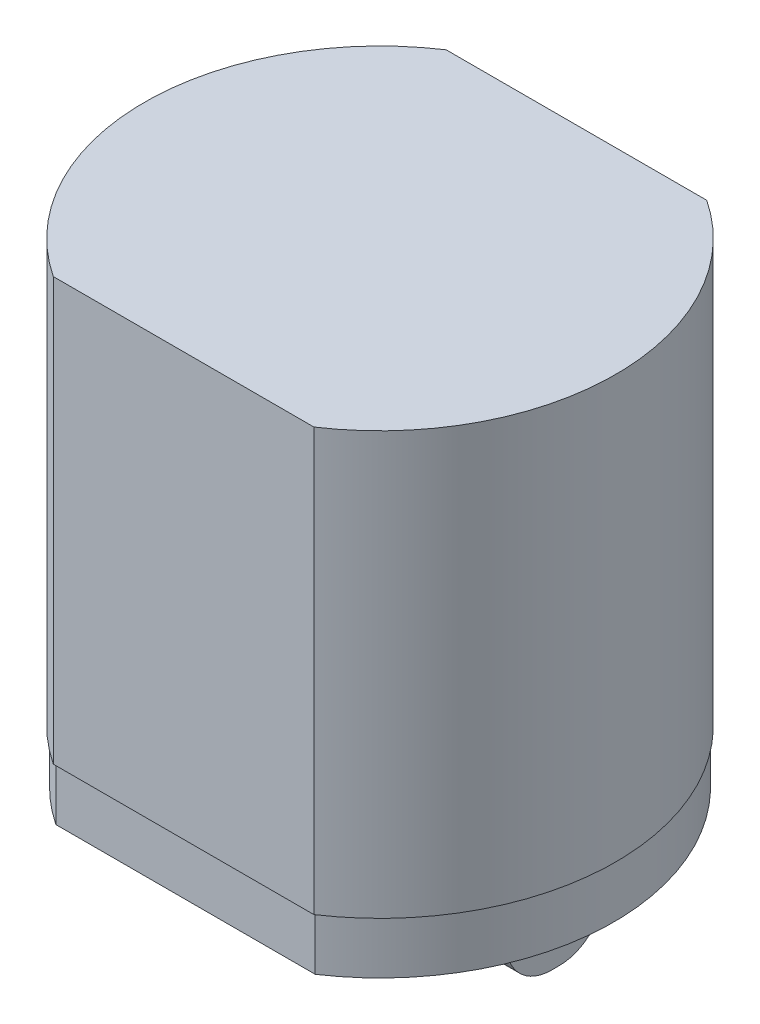
ISO-10303-21;
HEADER;
FILE_DESCRIPTION(('STEP AP214'),'2;1');
FILE_NAME('part.step','',(''),(''),'','','');
FILE_SCHEMA(('AUTOMOTIVE_DESIGN { 1 0 10303 214 1 1 1 1 }'));
ENDSEC;
DATA;
#1=APPLICATION_CONTEXT('core data for automotive mechanical design processes');
#2=APPLICATION_PROTOCOL_DEFINITION('international standard','automotive_design',2000,#1);
#3=PRODUCT_CONTEXT('',#1,'mechanical');
#4=PRODUCT('Part','Part','',(#3));
#5=PRODUCT_RELATED_PRODUCT_CATEGORY('part','',(#4));
#6=PRODUCT_DEFINITION_FORMATION('','',#4);
#7=PRODUCT_DEFINITION_CONTEXT('part definition',#1,'design');
#8=PRODUCT_DEFINITION('design','',#6,#7);
#9=PRODUCT_DEFINITION_SHAPE('','',#8);
#10=(LENGTH_UNIT() NAMED_UNIT(*) SI_UNIT(.MILLI.,.METRE.));
#11=(NAMED_UNIT(*) PLANE_ANGLE_UNIT() SI_UNIT($,.RADIAN.));
#12=(NAMED_UNIT(*) SI_UNIT($,.STERADIAN.) SOLID_ANGLE_UNIT());
#13=UNCERTAINTY_MEASURE_WITH_UNIT(LENGTH_MEASURE(1.E-05),#10,'distance_accuracy_value','');
#14=(GEOMETRIC_REPRESENTATION_CONTEXT(3) GLOBAL_UNCERTAINTY_ASSIGNED_CONTEXT((#13)) GLOBAL_UNIT_ASSIGNED_CONTEXT((#10,
#11,#12)) REPRESENTATION_CONTEXT('',''));
#15=CARTESIAN_POINT('',(0.,0.,0.));
#16=DIRECTION('',(0.,0.,1.));
#17=DIRECTION('',(1.,0.,0.));
#18=AXIS2_PLACEMENT_3D('',#15,#16,#17);
#19=CARTESIAN_POINT('',(0.,0.,0.));
#20=DIRECTION('',(0.,-1.,0.));
#21=DIRECTION('',(0.,0.,-1.));
#22=AXIS2_PLACEMENT_3D('',#19,#20,#21);
#23=CYLINDRICAL_SURFACE('',#22,6.);
#24=DIRECTION('',(0.,1.,0.));
#25=VECTOR('',#24,1.);
#26=CARTESIAN_POINT('',(3.3166247903554,0.,-5.));
#27=LINE('',#26,#25);
#28=CARTESIAN_POINT('',(3.3166247903554,-3.,-5.));
#29=VERTEX_POINT('',#28);
#30=CARTESIAN_POINT('',(3.3166247903554,-13.75,-5.));
#31=VERTEX_POINT('',#30);
#32=EDGE_CURVE('P0_E73',#29,#31,#27,.F.);
#33=ORIENTED_EDGE('',*,*,#32,.F.);
#34=CARTESIAN_POINT('',(0.,-3.,0.));
#35=DIRECTION('',(0.,1.,0.));
#36=DIRECTION('',(0.,0.,1.));
#37=AXIS2_PLACEMENT_3D('',#34,#35,#36);
#38=CIRCLE('',#37,6.);
#39=CARTESIAN_POINT('',(3.3166247903554,-3.,5.));
#40=VERTEX_POINT('',#39);
#41=EDGE_CURVE('P0_E78',#29,#40,#38,.F.);
#42=ORIENTED_EDGE('',*,*,#41,.T.);
#43=DIRECTION('',(0.,1.,0.));
#44=VECTOR('',#43,1.);
#45=CARTESIAN_POINT('',(3.3166247903554,0.,5.));
#46=LINE('',#45,#44);
#47=CARTESIAN_POINT('',(3.3166247903554,-13.75,5.));
#48=VERTEX_POINT('',#47);
#49=EDGE_CURVE('P0_E93',#48,#40,#46,.T.);
#50=ORIENTED_EDGE('',*,*,#49,.F.);
#51=CARTESIAN_POINT('',(0.,-13.75,0.));
#52=DIRECTION('',(0.,-1.,0.));
#53=DIRECTION('',(0.,0.,-1.));
#54=AXIS2_PLACEMENT_3D('',#51,#52,#53);
#55=CIRCLE('',#54,6.);
#56=EDGE_CURVE('P0_E106',#48,#31,#55,.F.);
#57=ORIENTED_EDGE('',*,*,#56,.T.);
#58=EDGE_LOOP('',(#33,#42,#50,#57));
#59=FACE_BOUND('',#58,.T.);
#60=ADVANCED_FACE('P0_F38',(#59),#23,.T.);
#61=CARTESIAN_POINT('',(-3.3166247903554,0.,-5.));
#62=DIRECTION('',(0.,0.,-1.));
#63=DIRECTION('',(-1.,0.,0.));
#64=AXIS2_PLACEMENT_3D('',#61,#62,#63);
#65=PLANE('',#64);
#66=DIRECTION('',(0.,-1.,0.));
#67=VECTOR('',#66,1.);
#68=CARTESIAN_POINT('',(-3.3166247903554,0.,-5.));
#69=LINE('',#68,#67);
#70=CARTESIAN_POINT('',(-3.3166247903554,-3.,-5.));
#71=VERTEX_POINT('',#70);
#72=CARTESIAN_POINT('',(-3.3166247903554,-13.75,-5.));
#73=VERTEX_POINT('',#72);
#74=EDGE_CURVE('P0_E98',#71,#73,#69,.T.);
#75=ORIENTED_EDGE('',*,*,#74,.F.);
#76=DIRECTION('',(1.,0.,0.));
#77=VECTOR('',#76,1.);
#78=CARTESIAN_POINT('',(-3.3166247903554,-3.,-5.));
#79=LINE('',#78,#77);
#80=EDGE_CURVE('P0_E52',#71,#29,#79,.T.);
#81=ORIENTED_EDGE('',*,*,#80,.T.);
#82=ORIENTED_EDGE('',*,*,#32,.T.);
#83=DIRECTION('',(1.,0.,0.));
#84=VECTOR('',#83,1.);
#85=CARTESIAN_POINT('',(0.,-13.75,-5.));
#86=LINE('',#85,#84);
#87=EDGE_CURVE('P0_E104',#31,#73,#86,.F.);
#88=ORIENTED_EDGE('',*,*,#87,.T.);
#89=EDGE_LOOP('',(#75,#81,#82,#88));
#90=FACE_BOUND('',#89,.T.);
#91=ADVANCED_FACE('P0_F111',(#90),#65,.T.);
#92=CARTESIAN_POINT('',(3.3166247903554,0.,5.));
#93=DIRECTION('',(0.,0.,1.));
#94=DIRECTION('',(1.,0.,0.));
#95=AXIS2_PLACEMENT_3D('',#92,#93,#94);
#96=PLANE('',#95);
#97=ORIENTED_EDGE('',*,*,#49,.T.);
#98=DIRECTION('',(-1.,0.,0.));
#99=VECTOR('',#98,1.);
#100=CARTESIAN_POINT('',(3.3166247903554,-3.,5.));
#101=LINE('',#100,#99);
#102=CARTESIAN_POINT('',(-3.3166247903554,-3.,5.));
#103=VERTEX_POINT('',#102);
#104=EDGE_CURVE('P0_E84',#40,#103,#101,.T.);
#105=ORIENTED_EDGE('',*,*,#104,.T.);
#106=DIRECTION('',(0.,-1.,0.));
#107=VECTOR('',#106,1.);
#108=CARTESIAN_POINT('',(-3.3166247903554,0.,5.));
#109=LINE('',#108,#107);
#110=CARTESIAN_POINT('',(-3.3166247903554,-13.75,5.));
#111=VERTEX_POINT('',#110);
#112=EDGE_CURVE('P0_E45',#111,#103,#109,.F.);
#113=ORIENTED_EDGE('',*,*,#112,.F.);
#114=DIRECTION('',(1.,0.,0.));
#115=VECTOR('',#114,1.);
#116=CARTESIAN_POINT('',(3.3166247903554,-13.75,5.));
#117=LINE('',#116,#115);
#118=EDGE_CURVE('P0_E60',#111,#48,#117,.T.);
#119=ORIENTED_EDGE('',*,*,#118,.T.);
#120=EDGE_LOOP('',(#97,#105,#113,#119));
#121=FACE_BOUND('',#120,.T.);
#122=ADVANCED_FACE('P0_F90',(#121),#96,.T.);
#123=CARTESIAN_POINT('',(0.,0.,0.));
#124=DIRECTION('',(0.,-1.,0.));
#125=DIRECTION('',(0.,0.,-1.));
#126=AXIS2_PLACEMENT_3D('',#123,#124,#125);
#127=CYLINDRICAL_SURFACE('',#126,6.);
#128=ORIENTED_EDGE('',*,*,#112,.T.);
#129=CARTESIAN_POINT('',(0.,-3.,0.));
#130=DIRECTION('',(0.,1.,0.));
#131=DIRECTION('',(0.,0.,1.));
#132=AXIS2_PLACEMENT_3D('',#129,#130,#131);
#133=CIRCLE('',#132,6.);
#134=EDGE_CURVE('P0_E11',#103,#71,#133,.F.);
#135=ORIENTED_EDGE('',*,*,#134,.T.);
#136=ORIENTED_EDGE('',*,*,#74,.T.);
#137=CARTESIAN_POINT('',(0.,-13.75,0.));
#138=DIRECTION('',(0.,-1.,0.));
#139=DIRECTION('',(0.,0.,-1.));
#140=AXIS2_PLACEMENT_3D('',#137,#138,#139);
#141=CIRCLE('',#140,6.);
#142=EDGE_CURVE('P0_E96',#73,#111,#141,.F.);
#143=ORIENTED_EDGE('',*,*,#142,.T.);
#144=EDGE_LOOP('',(#128,#135,#136,#143));
#145=FACE_BOUND('',#144,.T.);
#146=ADVANCED_FACE('P0_F95',(#145),#127,.T.);
#147=CARTESIAN_POINT('',(0.,-13.75,0.));
#148=DIRECTION('',(0.,1.,0.));
#149=DIRECTION('',(0.,0.,1.));
#150=AXIS2_PLACEMENT_3D('',#147,#148,#149);
#151=PLANE('',#150);
#152=ORIENTED_EDGE('',*,*,#87,.F.);
#153=ORIENTED_EDGE('',*,*,#56,.F.);
#154=ORIENTED_EDGE('',*,*,#118,.F.);
#155=ORIENTED_EDGE('',*,*,#142,.F.);
#156=EDGE_LOOP('',(#152,#153,#154,#155));
#157=FACE_BOUND('',#156,.T.);
#158=ADVANCED_FACE('P0_F122',(#157),#151,.F.);
#159=CARTESIAN_POINT('',(0.,-3.,0.));
#160=DIRECTION('',(0.,1.,0.));
#161=DIRECTION('',(0.,0.,1.));
#162=AXIS2_PLACEMENT_3D('',#159,#160,#161);
#163=PLANE('',#162);
#164=ORIENTED_EDGE('',*,*,#80,.F.);
#165=ORIENTED_EDGE('',*,*,#134,.F.);
#166=ORIENTED_EDGE('',*,*,#104,.F.);
#167=ORIENTED_EDGE('',*,*,#41,.F.);
#168=EDGE_LOOP('',(#164,#165,#166,#167));
#169=FACE_BOUND('',#168,.T.);
#170=ADVANCED_FACE('P0_F83',(#169),#163,.T.);
#171=CLOSED_SHELL('',(#60,#91,#122,#146,#158,#170));
#172=MANIFOLD_SOLID_BREP('P0_B2',#171);
#173=CARTESIAN_POINT('',(0.,-15.75,0.));
#174=DIRECTION('',(0.,-1.,0.));
#175=DIRECTION('',(0.,0.,-1.));
#176=AXIS2_PLACEMENT_3D('',#173,#174,#175);
#177=PLANE('',#176);
#178=CARTESIAN_POINT('',(0.,-15.75,0.));
#179=DIRECTION('',(0.,-1.,0.));
#180=DIRECTION('',(0.,0.,-1.));
#181=AXIS2_PLACEMENT_3D('',#178,#179,#180);
#182=CIRCLE('',#181,1.25);
#183=CARTESIAN_POINT('',(0.,-15.75,-1.25));
#184=VERTEX_POINT('',#183);
#185=EDGE_CURVE('P1_E17',#184,#184,#182,.F.);
#186=ORIENTED_EDGE('',*,*,#185,.F.);
#187=EDGE_LOOP('',(#186));
#188=FACE_BOUND('',#187,.T.);
#189=ADVANCED_FACE('P1_F14',(#188),#177,.T.);
#190=CARTESIAN_POINT('',(0.,-13.75,0.));
#191=DIRECTION('',(0.,-1.,0.));
#192=DIRECTION('',(0.,0.,-1.));
#193=AXIS2_PLACEMENT_3D('',#190,#191,#192);
#194=PLANE('',#193);
#195=CARTESIAN_POINT('',(0.,-13.75,0.));
#196=DIRECTION('',(0.,-1.,0.));
#197=DIRECTION('',(0.,0.,-1.));
#198=AXIS2_PLACEMENT_3D('',#195,#196,#197);
#199=CIRCLE('',#198,1.25);
#200=CARTESIAN_POINT('',(0.,-13.75,-1.25));
#201=VERTEX_POINT('',#200);
#202=EDGE_CURVE('P1_E10',#201,#201,#199,.T.);
#203=ORIENTED_EDGE('',*,*,#202,.F.);
#204=EDGE_LOOP('',(#203));
#205=FACE_BOUND('',#204,.T.);
#206=ADVANCED_FACE('P1_F29',(#205),#194,.F.);
#207=CARTESIAN_POINT('',(0.,-13.75,0.));
#208=DIRECTION('',(0.,-1.,0.));
#209=DIRECTION('',(0.,0.,-1.));
#210=AXIS2_PLACEMENT_3D('',#207,#208,#209);
#211=CYLINDRICAL_SURFACE('',#210,1.25);
#212=ORIENTED_EDGE('',*,*,#202,.T.);
#213=EDGE_LOOP('',(#212));
#214=FACE_BOUND('',#213,.T.);
#215=ORIENTED_EDGE('',*,*,#185,.T.);
#216=EDGE_LOOP('',(#215));
#217=FACE_BOUND('',#216,.T.);
#218=ADVANCED_FACE('P1_F26',(#214,#217),#211,.T.);
#219=CLOSED_SHELL('',(#189,#206,#218));
#220=MANIFOLD_SOLID_BREP('P1_B1',#219);
#221=CARTESIAN_POINT('',(0.,-15.1,0.));
#222=DIRECTION('',(0.,-1.,0.));
#223=DIRECTION('',(0.,0.,-1.));
#224=AXIS2_PLACEMENT_3D('',#221,#222,#223);
#225=CYLINDRICAL_SURFACE('',#224,2.5);
#226=CARTESIAN_POINT('',(0.,-15.1,0.));
#227=DIRECTION('',(0.,-1.,0.));
#228=DIRECTION('',(0.,0.,-1.));
#229=AXIS2_PLACEMENT_3D('',#226,#227,#228);
#230=CIRCLE('',#229,2.5);
#231=CARTESIAN_POINT('',(0.,-15.1,-2.5));
#232=VERTEX_POINT('',#231);
#233=EDGE_CURVE('P2_E19',#232,#232,#230,.F.);
#234=ORIENTED_EDGE('',*,*,#233,.F.);
#235=EDGE_LOOP('',(#234));
#236=FACE_BOUND('',#235,.T.);
#237=CARTESIAN_POINT('',(0.,-16.1,0.));
#238=DIRECTION('',(0.,-1.,0.));
#239=DIRECTION('',(0.,0.,-1.));
#240=AXIS2_PLACEMENT_3D('',#237,#238,#239);
#241=CIRCLE('',#240,2.5);
#242=CARTESIAN_POINT('',(0.,-16.1,-2.5));
#243=VERTEX_POINT('',#242);
#244=EDGE_CURVE('P2_E73',#243,#243,#241,.T.);
#245=ORIENTED_EDGE('',*,*,#244,.F.);
#246=EDGE_LOOP('',(#245));
#247=FACE_BOUND('',#246,.T.);
#248=ADVANCED_FACE('P2_F16',(#236,#247),#225,.T.);
#249=CARTESIAN_POINT('',(0.,-15.1,0.));
#250=DIRECTION('',(0.,-1.,0.));
#251=DIRECTION('',(0.,0.,-1.));
#252=AXIS2_PLACEMENT_3D('',#249,#250,#251);
#253=PLANE('',#252);
#254=ORIENTED_EDGE('',*,*,#233,.T.);
#255=EDGE_LOOP('',(#254));
#256=FACE_BOUND('',#255,.T.);
#257=DIRECTION('',(-1.,0.,0.));
#258=VECTOR('',#257,1.);
#259=CARTESIAN_POINT('',(-3.3166247903554,-15.1,-4.95));
#260=LINE('',#259,#258);
#261=CARTESIAN_POINT('',(3.30151480388691,-15.1,-4.94999999997127));
#262=VERTEX_POINT('',#261);
#263=CARTESIAN_POINT('',(-3.30151480389968,-15.1,-4.95));
#264=VERTEX_POINT('',#263);
#265=EDGE_CURVE('P2_E54',#262,#264,#260,.T.);
#266=ORIENTED_EDGE('',*,*,#265,.F.);
#267=CARTESIAN_POINT('',(0.,-15.1,0.));
#268=DIRECTION('',(0.,-1.,0.));
#269=DIRECTION('',(0.,0.,-1.));
#270=AXIS2_PLACEMENT_3D('',#267,#268,#269);
#271=CIRCLE('',#270,5.95);
#272=CARTESIAN_POINT('',(3.30151480389968,-15.1,4.95));
#273=VERTEX_POINT('',#272);
#274=EDGE_CURVE('P2_E78',#273,#262,#271,.F.);
#275=ORIENTED_EDGE('',*,*,#274,.F.);
#276=DIRECTION('',(1.,0.,0.));
#277=VECTOR('',#276,1.);
#278=CARTESIAN_POINT('',(3.3166247903554,-15.1,4.95));
#279=LINE('',#278,#277);
#280=CARTESIAN_POINT('',(-3.30151480389968,-15.1,4.95));
#281=VERTEX_POINT('',#280);
#282=EDGE_CURVE('P2_E69',#281,#273,#279,.T.);
#283=ORIENTED_EDGE('',*,*,#282,.F.);
#284=CARTESIAN_POINT('',(0.,-15.1,0.));
#285=DIRECTION('',(0.,-1.,0.));
#286=DIRECTION('',(0.,0.,-1.));
#287=AXIS2_PLACEMENT_3D('',#284,#285,#286);
#288=CIRCLE('',#287,5.95);
#289=EDGE_CURVE('P2_E64',#264,#281,#288,.F.);
#290=ORIENTED_EDGE('',*,*,#289,.F.);
#291=EDGE_LOOP('',(#266,#275,#283,#290));
#292=FACE_BOUND('',#291,.T.);
#293=ADVANCED_FACE('P2_F68',(#256,#292),#253,.T.);
#294=CARTESIAN_POINT('',(0.,-16.1,0.));
#295=DIRECTION('',(0.,-1.,0.));
#296=DIRECTION('',(0.,0.,-1.));
#297=AXIS2_PLACEMENT_3D('',#294,#295,#296);
#298=PLANE('',#297);
#299=CARTESIAN_POINT('',(0.,-16.1,0.));
#300=DIRECTION('',(0.,-1.,0.));
#301=DIRECTION('',(0.,0.,-1.));
#302=AXIS2_PLACEMENT_3D('',#299,#300,#301);
#303=CIRCLE('',#302,1.25);
#304=CARTESIAN_POINT('',(0.,-16.1,-1.25));
#305=VERTEX_POINT('',#304);
#306=EDGE_CURVE('P2_E91',#305,#305,#303,.F.);
#307=ORIENTED_EDGE('',*,*,#306,.T.);
#308=EDGE_LOOP('',(#307));
#309=FACE_BOUND('',#308,.T.);
#310=ORIENTED_EDGE('',*,*,#244,.T.);
#311=EDGE_LOOP('',(#310));
#312=FACE_BOUND('',#311,.T.);
#313=ADVANCED_FACE('P2_F106',(#309,#312),#298,.T.);
#314=CARTESIAN_POINT('',(0.,-13.75,0.));
#315=DIRECTION('',(0.,-1.,0.));
#316=DIRECTION('',(0.,0.,-1.));
#317=AXIS2_PLACEMENT_3D('',#314,#315,#316);
#318=CYLINDRICAL_SURFACE('',#317,5.95);
#319=ORIENTED_EDGE('',*,*,#289,.T.);
#320=DIRECTION('',(0.,1.,0.));
#321=VECTOR('',#320,1.);
#322=CARTESIAN_POINT('',(-3.30151480395552,-13.75,4.95));
#323=LINE('',#322,#321);
#324=CARTESIAN_POINT('',(-3.30151480391403,-13.75,4.94999999999043));
#325=VERTEX_POINT('',#324);
#326=EDGE_CURVE('P2_E84',#325,#281,#323,.F.);
#327=ORIENTED_EDGE('',*,*,#326,.F.);
#328=CARTESIAN_POINT('',(0.,-13.75,0.));
#329=DIRECTION('',(0.,-1.,0.));
#330=DIRECTION('',(0.,0.,-1.));
#331=AXIS2_PLACEMENT_3D('',#328,#329,#330);
#332=CIRCLE('',#331,5.95);
#333=CARTESIAN_POINT('',(-3.30151480391403,-13.75,-4.94999999999043));
#334=VERTEX_POINT('',#333);
#335=EDGE_CURVE('P2_E77',#325,#334,#332,.T.);
#336=ORIENTED_EDGE('',*,*,#335,.T.);
#337=DIRECTION('',(0.,1.,0.));
#338=VECTOR('',#337,1.);
#339=CARTESIAN_POINT('',(-3.30151480395552,-13.75,-4.95));
#340=LINE('',#339,#338);
#341=EDGE_CURVE('P2_E59',#264,#334,#340,.T.);
#342=ORIENTED_EDGE('',*,*,#341,.F.);
#343=EDGE_LOOP('',(#319,#327,#336,#342));
#344=FACE_BOUND('',#343,.T.);
#345=ADVANCED_FACE('P2_F76',(#344),#318,.T.);
#346=CARTESIAN_POINT('',(-3.3166247903554,-13.75,-4.95));
#347=DIRECTION('',(0.,0.,-1.));
#348=DIRECTION('',(-1.,0.,0.));
#349=AXIS2_PLACEMENT_3D('',#346,#347,#348);
#350=PLANE('',#349);
#351=ORIENTED_EDGE('',*,*,#265,.T.);
#352=ORIENTED_EDGE('',*,*,#341,.T.);
#353=DIRECTION('',(1.,0.,0.));
#354=VECTOR('',#353,1.);
#355=CARTESIAN_POINT('',(0.,-13.75,-4.94999999998085));
#356=LINE('',#355,#354);
#357=CARTESIAN_POINT('',(3.30151480390126,-13.75,-4.9499999999617));
#358=VERTEX_POINT('',#357);
#359=EDGE_CURVE('P2_E89',#334,#358,#356,.T.);
#360=ORIENTED_EDGE('',*,*,#359,.T.);
#361=DIRECTION('',(0.,-1.,0.));
#362=VECTOR('',#361,1.);
#363=CARTESIAN_POINT('',(3.30151480392997,-13.75,-4.94999999994255));
#364=LINE('',#363,#362);
#365=EDGE_CURVE('P2_E61',#262,#358,#364,.F.);
#366=ORIENTED_EDGE('',*,*,#365,.F.);
#367=EDGE_LOOP('',(#351,#352,#360,#366));
#368=FACE_BOUND('',#367,.T.);
#369=ADVANCED_FACE('P2_F56',(#368),#350,.T.);
#370=CARTESIAN_POINT('',(0.,-13.75,0.));
#371=DIRECTION('',(0.,-1.,0.));
#372=DIRECTION('',(0.,0.,-1.));
#373=AXIS2_PLACEMENT_3D('',#370,#371,#372);
#374=CYLINDRICAL_SURFACE('',#373,5.95);
#375=ORIENTED_EDGE('',*,*,#274,.T.);
#376=ORIENTED_EDGE('',*,*,#365,.T.);
#377=CARTESIAN_POINT('',(0.,-13.75,0.));
#378=DIRECTION('',(0.,-1.,0.));
#379=DIRECTION('',(0.,0.,-1.));
#380=AXIS2_PLACEMENT_3D('',#377,#378,#379);
#381=CIRCLE('',#380,5.95);
#382=CARTESIAN_POINT('',(3.30151480391403,-13.75,4.94999999999043));
#383=VERTEX_POINT('',#382);
#384=EDGE_CURVE('P2_E86',#358,#383,#381,.T.);
#385=ORIENTED_EDGE('',*,*,#384,.T.);
#386=DIRECTION('',(0.,1.,0.));
#387=VECTOR('',#386,1.);
#388=CARTESIAN_POINT('',(3.30151480395552,-13.75,4.95));
#389=LINE('',#388,#387);
#390=EDGE_CURVE('P2_E34',#273,#383,#389,.T.);
#391=ORIENTED_EDGE('',*,*,#390,.F.);
#392=EDGE_LOOP('',(#375,#376,#385,#391));
#393=FACE_BOUND('',#392,.T.);
#394=ADVANCED_FACE('P2_F123',(#393),#374,.T.);
#395=CARTESIAN_POINT('',(3.3166247903554,-13.75,4.95));
#396=DIRECTION('',(0.,0.,1.));
#397=DIRECTION('',(1.,0.,0.));
#398=AXIS2_PLACEMENT_3D('',#395,#396,#397);
#399=PLANE('',#398);
#400=ORIENTED_EDGE('',*,*,#282,.T.);
#401=ORIENTED_EDGE('',*,*,#390,.T.);
#402=DIRECTION('',(1.,0.,0.));
#403=VECTOR('',#402,1.);
#404=CARTESIAN_POINT('',(0.,-13.75,4.94999999998085));
#405=LINE('',#404,#403);
#406=EDGE_CURVE('P2_E25',#383,#325,#405,.F.);
#407=ORIENTED_EDGE('',*,*,#406,.T.);
#408=ORIENTED_EDGE('',*,*,#326,.T.);
#409=EDGE_LOOP('',(#400,#401,#407,#408));
#410=FACE_BOUND('',#409,.T.);
#411=ADVANCED_FACE('P2_F115',(#410),#399,.T.);
#412=CARTESIAN_POINT('',(0.,-13.75,0.));
#413=DIRECTION('',(0.,-1.,0.));
#414=DIRECTION('',(0.,0.,-1.));
#415=AXIS2_PLACEMENT_3D('',#412,#413,#414);
#416=CYLINDRICAL_SURFACE('',#415,1.25);
#417=CARTESIAN_POINT('',(0.,-13.75,0.));
#418=DIRECTION('',(0.,-1.,0.));
#419=DIRECTION('',(0.,0.,-1.));
#420=AXIS2_PLACEMENT_3D('',#417,#418,#419);
#421=CIRCLE('',#420,1.25);
#422=CARTESIAN_POINT('',(0.,-13.75,-1.25));
#423=VERTEX_POINT('',#422);
#424=EDGE_CURVE('P2_E11',#423,#423,#421,.F.);
#425=ORIENTED_EDGE('',*,*,#424,.T.);
#426=EDGE_LOOP('',(#425));
#427=FACE_BOUND('',#426,.T.);
#428=ORIENTED_EDGE('',*,*,#306,.F.);
#429=EDGE_LOOP('',(#428));
#430=FACE_BOUND('',#429,.T.);
#431=ADVANCED_FACE('P2_F109',(#427,#430),#416,.F.);
#432=CARTESIAN_POINT('',(0.,-13.75,0.));
#433=DIRECTION('',(0.,-1.,0.));
#434=DIRECTION('',(0.,0.,-1.));
#435=AXIS2_PLACEMENT_3D('',#432,#433,#434);
#436=PLANE('',#435);
#437=ORIENTED_EDGE('',*,*,#424,.F.);
#438=EDGE_LOOP('',(#437));
#439=FACE_BOUND('',#438,.T.);
#440=ORIENTED_EDGE('',*,*,#384,.F.);
#441=ORIENTED_EDGE('',*,*,#359,.F.);
#442=ORIENTED_EDGE('',*,*,#335,.F.);
#443=ORIENTED_EDGE('',*,*,#406,.F.);
#444=EDGE_LOOP('',(#440,#441,#442,#443));
#445=FACE_BOUND('',#444,.T.);
#446=ADVANCED_FACE('P2_F107',(#439,#445),#436,.F.);
#447=CLOSED_SHELL('',(#248,#293,#313,#345,#369,#394,#411,#431,#446));
#448=MANIFOLD_SOLID_BREP('P2_B1',#447);
#449=CARTESIAN_POINT('',(0.,-16.85,0.));
#450=DIRECTION('',(0.,-1.,0.));
#451=DIRECTION('',(0.,0.,-1.));
#452=AXIS2_PLACEMENT_3D('',#449,#450,#451);
#453=PLANE('',#452);
#454=DIRECTION('',(-1.,0.,0.));
#455=VECTOR('',#454,1.);
#456=CARTESIAN_POINT('',(-1.58293874990292,-16.85,0.0999999999999998));
#457=LINE('',#456,#455);
#458=CARTESIAN_POINT('',(-4.46587749980585,-16.85,0.0999999999999999));
#459=VERTEX_POINT('',#458);
#460=CARTESIAN_POINT('',(-3.16587749980585,-16.85,0.0999999999999999));
#461=VERTEX_POINT('',#460);
#462=EDGE_CURVE('P3_E125',#459,#461,#457,.F.);
#463=ORIENTED_EDGE('',*,*,#462,.F.);
#464=DIRECTION('',(0.,0.,-1.));
#465=VECTOR('',#464,1.);
#466=CARTESIAN_POINT('',(-4.46587749980585,-16.85,0.));
#467=LINE('',#466,#465);
#468=CARTESIAN_POINT('',(-4.46587749980585,-16.85,-0.0999999999999999));
#469=VERTEX_POINT('',#468);
#470=EDGE_CURVE('P3_E115',#459,#469,#467,.T.);
#471=ORIENTED_EDGE('',*,*,#470,.T.);
#472=DIRECTION('',(1.,0.,0.));
#473=VECTOR('',#472,1.);
#474=CARTESIAN_POINT('',(-2.23293874990292,-16.85,-0.0999999999999998));
#475=LINE('',#474,#473);
#476=CARTESIAN_POINT('',(-3.16587749980585,-16.85,-0.0999999999999999));
#477=VERTEX_POINT('',#476);
#478=EDGE_CURVE('P3_E122',#477,#469,#475,.F.);
#479=ORIENTED_EDGE('',*,*,#478,.F.);
#480=DIRECTION('',(0.,0.,-1.));
#481=VECTOR('',#480,1.);
#482=CARTESIAN_POINT('',(-3.16587749980585,-16.85,0.));
#483=LINE('',#482,#481);
#484=EDGE_CURVE('P3_E64',#477,#461,#483,.F.);
#485=ORIENTED_EDGE('',*,*,#484,.T.);
#486=EDGE_LOOP('',(#463,#471,#479,#485));
#487=FACE_BOUND('',#486,.T.);
#488=ADVANCED_FACE('P3_F16',(#487),#453,.T.);
#489=CARTESIAN_POINT('',(-4.46587749980585,-15.1,-1.25));
#490=DIRECTION('',(0.,0.,-1.));
#491=DIRECTION('',(-1.,0.,0.));
#492=AXIS2_PLACEMENT_3D('',#489,#490,#491);
#493=PLANE('',#492);
#494=DIRECTION('',(1.,0.,0.));
#495=VECTOR('',#494,1.);
#496=CARTESIAN_POINT('',(0.,-15.1,-1.25));
#497=LINE('',#496,#495);
#498=CARTESIAN_POINT('',(-4.46587749980585,-15.1,-1.25));
#499=VERTEX_POINT('',#498);
#500=CARTESIAN_POINT('',(-3.16587749980585,-15.1,-1.25));
#501=VERTEX_POINT('',#500);
#502=EDGE_CURVE('P3_E91',#499,#501,#497,.T.);
#503=ORIENTED_EDGE('',*,*,#502,.T.);
#504=DIRECTION('',(0.,1.,0.));
#505=VECTOR('',#504,1.);
#506=CARTESIAN_POINT('',(-3.16587749980585,-15.1,-1.25));
#507=LINE('',#506,#505);
#508=CARTESIAN_POINT('',(-3.16587749980585,-15.7,-1.25));
#509=VERTEX_POINT('',#508);
#510=EDGE_CURVE('P3_E68',#501,#509,#507,.F.);
#511=ORIENTED_EDGE('',*,*,#510,.T.);
#512=DIRECTION('',(1.,0.,0.));
#513=VECTOR('',#512,1.);
#514=CARTESIAN_POINT('',(-2.23293874990292,-15.7,-1.25));
#515=LINE('',#514,#513);
#516=CARTESIAN_POINT('',(-4.46587749980585,-15.7,-1.25));
#517=VERTEX_POINT('',#516);
#518=EDGE_CURVE('P3_E121',#517,#509,#515,.T.);
#519=ORIENTED_EDGE('',*,*,#518,.F.);
#520=DIRECTION('',(0.,1.,0.));
#521=VECTOR('',#520,1.);
#522=CARTESIAN_POINT('',(-4.46587749980585,-15.1,-1.25));
#523=LINE('',#522,#521);
#524=EDGE_CURVE('P3_E34',#517,#499,#523,.T.);
#525=ORIENTED_EDGE('',*,*,#524,.T.);
#526=EDGE_LOOP('',(#503,#511,#519,#525));
#527=FACE_BOUND('',#526,.T.);
#528=ADVANCED_FACE('P3_F149',(#527),#493,.T.);
#529=CARTESIAN_POINT('',(-3.16587749980585,-15.1,1.25));
#530=DIRECTION('',(0.,0.,1.));
#531=DIRECTION('',(1.,0.,0.));
#532=AXIS2_PLACEMENT_3D('',#529,#530,#531);
#533=PLANE('',#532);
#534=DIRECTION('',(1.,0.,0.));
#535=VECTOR('',#534,1.);
#536=CARTESIAN_POINT('',(0.,-15.1,1.25));
#537=LINE('',#536,#535);
#538=CARTESIAN_POINT('',(-3.16587749980585,-15.1,1.25));
#539=VERTEX_POINT('',#538);
#540=CARTESIAN_POINT('',(-4.46587749980585,-15.1,1.25));
#541=VERTEX_POINT('',#540);
#542=EDGE_CURVE('P3_E78',#539,#541,#537,.F.);
#543=ORIENTED_EDGE('',*,*,#542,.T.);
#544=DIRECTION('',(0.,1.,0.));
#545=VECTOR('',#544,1.);
#546=CARTESIAN_POINT('',(-4.46587749980585,-15.1,1.25));
#547=LINE('',#546,#545);
#548=CARTESIAN_POINT('',(-4.46587749980585,-15.7,1.25));
#549=VERTEX_POINT('',#548);
#550=EDGE_CURVE('P3_E83',#541,#549,#547,.F.);
#551=ORIENTED_EDGE('',*,*,#550,.T.);
#552=DIRECTION('',(-1.,0.,0.));
#553=VECTOR('',#552,1.);
#554=CARTESIAN_POINT('',(-1.58293874990292,-15.7,1.25));
#555=LINE('',#554,#553);
#556=CARTESIAN_POINT('',(-3.16587749980585,-15.7,1.25));
#557=VERTEX_POINT('',#556);
#558=EDGE_CURVE('P3_E81',#557,#549,#555,.T.);
#559=ORIENTED_EDGE('',*,*,#558,.F.);
#560=DIRECTION('',(0.,1.,0.));
#561=VECTOR('',#560,1.);
#562=CARTESIAN_POINT('',(-3.16587749980585,-15.1,1.25));
#563=LINE('',#562,#561);
#564=EDGE_CURVE('P3_E75',#557,#539,#563,.T.);
#565=ORIENTED_EDGE('',*,*,#564,.T.);
#566=EDGE_LOOP('',(#543,#551,#559,#565));
#567=FACE_BOUND('',#566,.T.);
#568=ADVANCED_FACE('P3_F77',(#567),#533,.T.);
#569=CARTESIAN_POINT('',(-2.23293874990292,-15.7,-0.1));
#570=DIRECTION('',(1.,0.,0.));
#571=DIRECTION('',(0.,0.,-1.));
#572=AXIS2_PLACEMENT_3D('',#569,#570,#571);
#573=CYLINDRICAL_SURFACE('',#572,1.15);
#574=CARTESIAN_POINT('',(-4.46587749980585,-15.7,-0.1));
#575=DIRECTION('',(1.,0.,0.));
#576=DIRECTION('',(0.,0.,-1.));
#577=AXIS2_PLACEMENT_3D('',#574,#575,#576);
#578=CIRCLE('',#577,1.15);
#579=EDGE_CURVE('P3_E96',#517,#469,#578,.F.);
#580=ORIENTED_EDGE('',*,*,#579,.F.);
#581=ORIENTED_EDGE('',*,*,#518,.T.);
#582=CARTESIAN_POINT('',(-3.16587749980585,-15.7,-0.1));
#583=DIRECTION('',(1.,0.,0.));
#584=DIRECTION('',(0.,0.,-1.));
#585=AXIS2_PLACEMENT_3D('',#582,#583,#584);
#586=CIRCLE('',#585,1.15);
#587=EDGE_CURVE('P3_E19',#477,#509,#586,.T.);
#588=ORIENTED_EDGE('',*,*,#587,.F.);
#589=ORIENTED_EDGE('',*,*,#478,.T.);
#590=EDGE_LOOP('',(#580,#581,#588,#589));
#591=FACE_BOUND('',#590,.T.);
#592=ADVANCED_FACE('P3_F119',(#591),#573,.T.);
#593=CARTESIAN_POINT('',(-1.58293874990292,-15.7,0.1));
#594=DIRECTION('',(-1.,0.,0.));
#595=DIRECTION('',(0.,0.,1.));
#596=AXIS2_PLACEMENT_3D('',#593,#594,#595);
#597=CYLINDRICAL_SURFACE('',#596,1.15);
#598=CARTESIAN_POINT('',(-3.16587749980585,-15.7,0.1));
#599=DIRECTION('',(-1.,0.,0.));
#600=DIRECTION('',(0.,0.,1.));
#601=AXIS2_PLACEMENT_3D('',#598,#599,#600);
#602=CIRCLE('',#601,1.15);
#603=EDGE_CURVE('P3_E94',#557,#461,#602,.F.);
#604=ORIENTED_EDGE('',*,*,#603,.F.);
#605=ORIENTED_EDGE('',*,*,#558,.T.);
#606=CARTESIAN_POINT('',(-4.46587749980585,-15.7,0.1));
#607=DIRECTION('',(-1.,0.,0.));
#608=DIRECTION('',(0.,0.,1.));
#609=AXIS2_PLACEMENT_3D('',#606,#607,#608);
#610=CIRCLE('',#609,1.15);
#611=EDGE_CURVE('P3_E108',#459,#549,#610,.T.);
#612=ORIENTED_EDGE('',*,*,#611,.F.);
#613=ORIENTED_EDGE('',*,*,#462,.T.);
#614=EDGE_LOOP('',(#604,#605,#612,#613));
#615=FACE_BOUND('',#614,.T.);
#616=ADVANCED_FACE('P3_F146',(#615),#597,.T.);
#617=CARTESIAN_POINT('',(0.,-15.1,0.));
#618=DIRECTION('',(0.,-1.,0.));
#619=DIRECTION('',(0.,0.,-1.));
#620=AXIS2_PLACEMENT_3D('',#617,#618,#619);
#621=PLANE('',#620);
#622=ORIENTED_EDGE('',*,*,#542,.F.);
#623=DIRECTION('',(0.,0.,-1.));
#624=VECTOR('',#623,1.);
#625=CARTESIAN_POINT('',(-3.16587749980585,-15.1,-1.25));
#626=LINE('',#625,#624);
#627=EDGE_CURVE('P3_E88',#501,#539,#626,.F.);
#628=ORIENTED_EDGE('',*,*,#627,.F.);
#629=ORIENTED_EDGE('',*,*,#502,.F.);
#630=DIRECTION('',(0.,0.,1.));
#631=VECTOR('',#630,1.);
#632=CARTESIAN_POINT('',(-4.46587749980585,-15.1,1.25));
#633=LINE('',#632,#631);
#634=EDGE_CURVE('P3_E90',#541,#499,#633,.F.);
#635=ORIENTED_EDGE('',*,*,#634,.F.);
#636=EDGE_LOOP('',(#622,#628,#629,#635));
#637=FACE_BOUND('',#636,.T.);
#638=ADVANCED_FACE('P3_F87',(#637),#621,.F.);
#639=CARTESIAN_POINT('',(-3.16587749980585,-15.1,-1.25));
#640=DIRECTION('',(1.,0.,0.));
#641=DIRECTION('',(0.,0.,-1.));
#642=AXIS2_PLACEMENT_3D('',#639,#640,#641);
#643=PLANE('',#642);
#644=CARTESIAN_POINT('',(-3.16587749980585,-15.8828467361708,0.));
#645=DIRECTION('',(1.,0.,0.));
#646=DIRECTION('',(0.,0.,-1.));
#647=AXIS2_PLACEMENT_3D('',#644,#645,#646);
#648=CIRCLE('',#647,0.5);
#649=CARTESIAN_POINT('',(-3.16587749980585,-15.8828467361708,-0.5));
#650=VERTEX_POINT('',#649);
#651=EDGE_CURVE('P3_E25',#650,#650,#648,.F.);
#652=ORIENTED_EDGE('',*,*,#651,.T.);
#653=EDGE_LOOP('',(#652));
#654=FACE_BOUND('',#653,.T.);
#655=ORIENTED_EDGE('',*,*,#603,.T.);
#656=ORIENTED_EDGE('',*,*,#484,.F.);
#657=ORIENTED_EDGE('',*,*,#587,.T.);
#658=ORIENTED_EDGE('',*,*,#510,.F.);
#659=ORIENTED_EDGE('',*,*,#627,.T.);
#660=ORIENTED_EDGE('',*,*,#564,.F.);
#661=EDGE_LOOP('',(#655,#656,#657,#658,#659,#660));
#662=FACE_BOUND('',#661,.T.);
#663=ADVANCED_FACE('P3_F93',(#654,#662),#643,.T.);
#664=CARTESIAN_POINT('',(-4.46587749980585,-15.1,1.25));
#665=DIRECTION('',(-1.,0.,0.));
#666=DIRECTION('',(0.,0.,1.));
#667=AXIS2_PLACEMENT_3D('',#664,#665,#666);
#668=PLANE('',#667);
#669=CARTESIAN_POINT('',(-4.46587749980585,-15.8828467361708,0.));
#670=DIRECTION('',(1.,0.,0.));
#671=DIRECTION('',(0.,0.,-1.));
#672=AXIS2_PLACEMENT_3D('',#669,#670,#671);
#673=CIRCLE('',#672,0.5);
#674=CARTESIAN_POINT('',(-4.46587749980585,-15.8828467361708,-0.5));
#675=VERTEX_POINT('',#674);
#676=EDGE_CURVE('P3_E11',#675,#675,#673,.T.);
#677=ORIENTED_EDGE('',*,*,#676,.T.);
#678=EDGE_LOOP('',(#677));
#679=FACE_BOUND('',#678,.T.);
#680=ORIENTED_EDGE('',*,*,#634,.T.);
#681=ORIENTED_EDGE('',*,*,#524,.F.);
#682=ORIENTED_EDGE('',*,*,#579,.T.);
#683=ORIENTED_EDGE('',*,*,#470,.F.);
#684=ORIENTED_EDGE('',*,*,#611,.T.);
#685=ORIENTED_EDGE('',*,*,#550,.F.);
#686=EDGE_LOOP('',(#680,#681,#682,#683,#684,#685));
#687=FACE_BOUND('',#686,.T.);
#688=ADVANCED_FACE('P3_F114',(#679,#687),#668,.T.);
#689=CARTESIAN_POINT('',(0.446587749980585,-15.8828467361708,0.));
#690=DIRECTION('',(1.,0.,0.));
#691=DIRECTION('',(0.,0.,-1.));
#692=AXIS2_PLACEMENT_3D('',#689,#690,#691);
#693=CYLINDRICAL_SURFACE('',#692,0.5);
#694=ORIENTED_EDGE('',*,*,#651,.F.);
#695=EDGE_LOOP('',(#694));
#696=FACE_BOUND('',#695,.T.);
#697=ORIENTED_EDGE('',*,*,#676,.F.);
#698=EDGE_LOOP('',(#697));
#699=FACE_BOUND('',#698,.T.);
#700=ADVANCED_FACE('P3_F154',(#696,#699),#693,.F.);
#701=CLOSED_SHELL('',(#488,#528,#568,#592,#616,#638,#663,#688,#700));
#702=MANIFOLD_SOLID_BREP('P3_B1',#701);
#703=CARTESIAN_POINT('',(0.,-16.85,0.));
#704=DIRECTION('',(0.,-1.,0.));
#705=DIRECTION('',(0.,0.,-1.));
#706=AXIS2_PLACEMENT_3D('',#703,#704,#705);
#707=PLANE('',#706);
#708=DIRECTION('',(-1.,0.,0.));
#709=VECTOR('',#708,1.);
#710=CARTESIAN_POINT('',(2.23293874990292,-16.85,0.0999999999999998));
#711=LINE('',#710,#709);
#712=CARTESIAN_POINT('',(3.16587749980585,-16.85,0.0999999999999999));
#713=VERTEX_POINT('',#712);
#714=CARTESIAN_POINT('',(4.46587749980585,-16.85,0.0999999999999999));
#715=VERTEX_POINT('',#714);
#716=EDGE_CURVE('P4_E122',#713,#715,#711,.F.);
#717=ORIENTED_EDGE('',*,*,#716,.F.);
#718=DIRECTION('',(0.,0.,-1.));
#719=VECTOR('',#718,1.);
#720=CARTESIAN_POINT('',(3.16587749980585,-16.85,0.));
#721=LINE('',#720,#719);
#722=CARTESIAN_POINT('',(3.16587749980585,-16.85,-0.0999999999999999));
#723=VERTEX_POINT('',#722);
#724=EDGE_CURVE('P4_E114',#713,#723,#721,.T.);
#725=ORIENTED_EDGE('',*,*,#724,.T.);
#726=DIRECTION('',(1.,0.,0.));
#727=VECTOR('',#726,1.);
#728=CARTESIAN_POINT('',(1.58293874990292,-16.85,-0.0999999999999998));
#729=LINE('',#728,#727);
#730=CARTESIAN_POINT('',(4.46587749980585,-16.85,-0.0999999999999999));
#731=VERTEX_POINT('',#730);
#732=EDGE_CURVE('P4_E77',#731,#723,#729,.F.);
#733=ORIENTED_EDGE('',*,*,#732,.F.);
#734=DIRECTION('',(0.,0.,-1.));
#735=VECTOR('',#734,1.);
#736=CARTESIAN_POINT('',(4.46587749980585,-16.85,0.));
#737=LINE('',#736,#735);
#738=EDGE_CURVE('P4_E66',#731,#715,#737,.F.);
#739=ORIENTED_EDGE('',*,*,#738,.T.);
#740=EDGE_LOOP('',(#717,#725,#733,#739));
#741=FACE_BOUND('',#740,.T.);
#742=ADVANCED_FACE('P4_F17',(#741),#707,.T.);
#743=CARTESIAN_POINT('',(4.46587749980585,-15.1,1.25));
#744=DIRECTION('',(0.,0.,1.));
#745=DIRECTION('',(1.,0.,0.));
#746=AXIS2_PLACEMENT_3D('',#743,#744,#745);
#747=PLANE('',#746);
#748=DIRECTION('',(1.,0.,0.));
#749=VECTOR('',#748,1.);
#750=CARTESIAN_POINT('',(0.,-15.1,1.25));
#751=LINE('',#750,#749);
#752=CARTESIAN_POINT('',(4.46587749980585,-15.1,1.25));
#753=VERTEX_POINT('',#752);
#754=CARTESIAN_POINT('',(3.16587749980585,-15.1,1.25));
#755=VERTEX_POINT('',#754);
#756=EDGE_CURVE('P4_E84',#753,#755,#751,.F.);
#757=ORIENTED_EDGE('',*,*,#756,.T.);
#758=DIRECTION('',(0.,1.,0.));
#759=VECTOR('',#758,1.);
#760=CARTESIAN_POINT('',(3.16587749980585,-15.1,1.25));
#761=LINE('',#760,#759);
#762=CARTESIAN_POINT('',(3.16587749980585,-15.7,1.25));
#763=VERTEX_POINT('',#762);
#764=EDGE_CURVE('P4_E129',#755,#763,#761,.F.);
#765=ORIENTED_EDGE('',*,*,#764,.T.);
#766=DIRECTION('',(-1.,0.,0.));
#767=VECTOR('',#766,1.);
#768=CARTESIAN_POINT('',(2.23293874990292,-15.7,1.25));
#769=LINE('',#768,#767);
#770=CARTESIAN_POINT('',(4.46587749980585,-15.7,1.25));
#771=VERTEX_POINT('',#770);
#772=EDGE_CURVE('P4_E103',#771,#763,#769,.T.);
#773=ORIENTED_EDGE('',*,*,#772,.F.);
#774=DIRECTION('',(0.,1.,0.));
#775=VECTOR('',#774,1.);
#776=CARTESIAN_POINT('',(4.46587749980585,-15.1,1.25));
#777=LINE('',#776,#775);
#778=EDGE_CURVE('P4_E127',#771,#753,#777,.T.);
#779=ORIENTED_EDGE('',*,*,#778,.T.);
#780=EDGE_LOOP('',(#757,#765,#773,#779));
#781=FACE_BOUND('',#780,.T.);
#782=ADVANCED_FACE('P4_F149',(#781),#747,.T.);
#783=CARTESIAN_POINT('',(3.16587749980585,-15.1,-1.25));
#784=DIRECTION('',(0.,0.,-1.));
#785=DIRECTION('',(-1.,0.,0.));
#786=AXIS2_PLACEMENT_3D('',#783,#784,#785);
#787=PLANE('',#786);
#788=DIRECTION('',(1.,0.,0.));
#789=VECTOR('',#788,1.);
#790=CARTESIAN_POINT('',(0.,-15.1,-1.25));
#791=LINE('',#790,#789);
#792=CARTESIAN_POINT('',(3.16587749980585,-15.1,-1.25));
#793=VERTEX_POINT('',#792);
#794=CARTESIAN_POINT('',(4.46587749980585,-15.1,-1.25));
#795=VERTEX_POINT('',#794);
#796=EDGE_CURVE('P4_E79',#793,#795,#791,.T.);
#797=ORIENTED_EDGE('',*,*,#796,.T.);
#798=DIRECTION('',(0.,1.,0.));
#799=VECTOR('',#798,1.);
#800=CARTESIAN_POINT('',(4.46587749980585,-15.1,-1.25));
#801=LINE('',#800,#799);
#802=CARTESIAN_POINT('',(4.46587749980585,-15.7,-1.25));
#803=VERTEX_POINT('',#802);
#804=EDGE_CURVE('P4_E70',#795,#803,#801,.F.);
#805=ORIENTED_EDGE('',*,*,#804,.T.);
#806=DIRECTION('',(1.,0.,0.));
#807=VECTOR('',#806,1.);
#808=CARTESIAN_POINT('',(1.58293874990292,-15.7,-1.25));
#809=LINE('',#808,#807);
#810=CARTESIAN_POINT('',(3.16587749980585,-15.7,-1.25));
#811=VERTEX_POINT('',#810);
#812=EDGE_CURVE('P4_E119',#811,#803,#809,.T.);
#813=ORIENTED_EDGE('',*,*,#812,.F.);
#814=DIRECTION('',(0.,1.,0.));
#815=VECTOR('',#814,1.);
#816=CARTESIAN_POINT('',(3.16587749980585,-15.1,-1.25));
#817=LINE('',#816,#815);
#818=EDGE_CURVE('P4_E35',#811,#793,#817,.T.);
#819=ORIENTED_EDGE('',*,*,#818,.T.);
#820=EDGE_LOOP('',(#797,#805,#813,#819));
#821=FACE_BOUND('',#820,.T.);
#822=ADVANCED_FACE('P4_F80',(#821),#787,.T.);
#823=CARTESIAN_POINT('',(1.58293874990292,-15.7,-0.1));
#824=DIRECTION('',(1.,0.,0.));
#825=DIRECTION('',(0.,0.,-1.));
#826=AXIS2_PLACEMENT_3D('',#823,#824,#825);
#827=CYLINDRICAL_SURFACE('',#826,1.15);
#828=CARTESIAN_POINT('',(3.16587749980585,-15.7,-0.1));
#829=DIRECTION('',(1.,0.,0.));
#830=DIRECTION('',(0.,0.,-1.));
#831=AXIS2_PLACEMENT_3D('',#828,#829,#830);
#832=CIRCLE('',#831,1.15);
#833=EDGE_CURVE('P4_E91',#811,#723,#832,.F.);
#834=ORIENTED_EDGE('',*,*,#833,.F.);
#835=ORIENTED_EDGE('',*,*,#812,.T.);
#836=CARTESIAN_POINT('',(4.46587749980585,-15.7,-0.1));
#837=DIRECTION('',(1.,0.,0.));
#838=DIRECTION('',(0.,0.,-1.));
#839=AXIS2_PLACEMENT_3D('',#836,#837,#838);
#840=CIRCLE('',#839,1.15);
#841=EDGE_CURVE('P4_E20',#731,#803,#840,.T.);
#842=ORIENTED_EDGE('',*,*,#841,.F.);
#843=ORIENTED_EDGE('',*,*,#732,.T.);
#844=EDGE_LOOP('',(#834,#835,#842,#843));
#845=FACE_BOUND('',#844,.T.);
#846=ADVANCED_FACE('P4_F118',(#845),#827,.T.);
#847=CARTESIAN_POINT('',(2.23293874990292,-15.7,0.1));
#848=DIRECTION('',(-1.,0.,0.));
#849=DIRECTION('',(0.,0.,1.));
#850=AXIS2_PLACEMENT_3D('',#847,#848,#849);
#851=CYLINDRICAL_SURFACE('',#850,1.15);
#852=CARTESIAN_POINT('',(4.46587749980585,-15.7,0.1));
#853=DIRECTION('',(-1.,0.,0.));
#854=DIRECTION('',(0.,0.,1.));
#855=AXIS2_PLACEMENT_3D('',#852,#853,#854);
#856=CIRCLE('',#855,1.15);
#857=EDGE_CURVE('P4_E89',#771,#715,#856,.F.);
#858=ORIENTED_EDGE('',*,*,#857,.F.);
#859=ORIENTED_EDGE('',*,*,#772,.T.);
#860=CARTESIAN_POINT('',(3.16587749980585,-15.7,0.1));
#861=DIRECTION('',(-1.,0.,0.));
#862=DIRECTION('',(0.,0.,1.));
#863=AXIS2_PLACEMENT_3D('',#860,#861,#862);
#864=CIRCLE('',#863,1.15);
#865=EDGE_CURVE('P4_E99',#713,#763,#864,.T.);
#866=ORIENTED_EDGE('',*,*,#865,.F.);
#867=ORIENTED_EDGE('',*,*,#716,.T.);
#868=EDGE_LOOP('',(#858,#859,#866,#867));
#869=FACE_BOUND('',#868,.T.);
#870=ADVANCED_FACE('P4_F145',(#869),#851,.T.);
#871=CARTESIAN_POINT('',(0.,-15.1,0.));
#872=DIRECTION('',(0.,-1.,0.));
#873=DIRECTION('',(0.,0.,-1.));
#874=AXIS2_PLACEMENT_3D('',#871,#872,#873);
#875=PLANE('',#874);
#876=ORIENTED_EDGE('',*,*,#796,.F.);
#877=DIRECTION('',(0.,0.,1.));
#878=VECTOR('',#877,1.);
#879=CARTESIAN_POINT('',(3.16587749980585,-15.1,1.25));
#880=LINE('',#879,#878);
#881=EDGE_CURVE('P4_E97',#755,#793,#880,.F.);
#882=ORIENTED_EDGE('',*,*,#881,.F.);
#883=ORIENTED_EDGE('',*,*,#756,.F.);
#884=DIRECTION('',(0.,0.,-1.));
#885=VECTOR('',#884,1.);
#886=CARTESIAN_POINT('',(4.46587749980585,-15.1,-1.25));
#887=LINE('',#886,#885);
#888=EDGE_CURVE('P4_E75',#795,#753,#887,.F.);
#889=ORIENTED_EDGE('',*,*,#888,.F.);
#890=EDGE_LOOP('',(#876,#882,#883,#889));
#891=FACE_BOUND('',#890,.T.);
#892=ADVANCED_FACE('P4_F87',(#891),#875,.F.);
#893=CARTESIAN_POINT('',(4.46587749980585,-15.1,-1.25));
#894=DIRECTION('',(1.,0.,0.));
#895=DIRECTION('',(0.,0.,-1.));
#896=AXIS2_PLACEMENT_3D('',#893,#894,#895);
#897=PLANE('',#896);
#898=CARTESIAN_POINT('',(4.46587749980585,-15.8828467361708,0.));
#899=DIRECTION('',(1.,0.,0.));
#900=DIRECTION('',(0.,0.,-1.));
#901=AXIS2_PLACEMENT_3D('',#898,#899,#900);
#902=CIRCLE('',#901,0.5);
#903=CARTESIAN_POINT('',(4.46587749980585,-15.8828467361708,-0.5));
#904=VERTEX_POINT('',#903);
#905=EDGE_CURVE('P4_E26',#904,#904,#902,.F.);
#906=ORIENTED_EDGE('',*,*,#905,.T.);
#907=EDGE_LOOP('',(#906));
#908=FACE_BOUND('',#907,.T.);
#909=ORIENTED_EDGE('',*,*,#857,.T.);
#910=ORIENTED_EDGE('',*,*,#738,.F.);
#911=ORIENTED_EDGE('',*,*,#841,.T.);
#912=ORIENTED_EDGE('',*,*,#804,.F.);
#913=ORIENTED_EDGE('',*,*,#888,.T.);
#914=ORIENTED_EDGE('',*,*,#778,.F.);
#915=EDGE_LOOP('',(#909,#910,#911,#912,#913,#914));
#916=FACE_BOUND('',#915,.T.);
#917=ADVANCED_FACE('P4_F73',(#908,#916),#897,.T.);
#918=CARTESIAN_POINT('',(3.16587749980585,-15.1,1.25));
#919=DIRECTION('',(-1.,0.,0.));
#920=DIRECTION('',(0.,0.,1.));
#921=AXIS2_PLACEMENT_3D('',#918,#919,#920);
#922=PLANE('',#921);
#923=CARTESIAN_POINT('',(3.16587749980585,-15.8828467361708,0.));
#924=DIRECTION('',(1.,0.,0.));
#925=DIRECTION('',(0.,0.,-1.));
#926=AXIS2_PLACEMENT_3D('',#923,#924,#925);
#927=CIRCLE('',#926,0.5);
#928=CARTESIAN_POINT('',(3.16587749980585,-15.8828467361708,-0.5));
#929=VERTEX_POINT('',#928);
#930=EDGE_CURVE('P4_E11',#929,#929,#927,.T.);
#931=ORIENTED_EDGE('',*,*,#930,.T.);
#932=EDGE_LOOP('',(#931));
#933=FACE_BOUND('',#932,.T.);
#934=ORIENTED_EDGE('',*,*,#881,.T.);
#935=ORIENTED_EDGE('',*,*,#818,.F.);
#936=ORIENTED_EDGE('',*,*,#833,.T.);
#937=ORIENTED_EDGE('',*,*,#724,.F.);
#938=ORIENTED_EDGE('',*,*,#865,.T.);
#939=ORIENTED_EDGE('',*,*,#764,.F.);
#940=EDGE_LOOP('',(#934,#935,#936,#937,#938,#939));
#941=FACE_BOUND('',#940,.T.);
#942=ADVANCED_FACE('P4_F113',(#933,#941),#922,.T.);
#943=CARTESIAN_POINT('',(0.446587749980585,-15.8828467361708,0.));
#944=DIRECTION('',(1.,0.,0.));
#945=DIRECTION('',(0.,0.,-1.));
#946=AXIS2_PLACEMENT_3D('',#943,#944,#945);
#947=CYLINDRICAL_SURFACE('',#946,0.5);
#948=ORIENTED_EDGE('',*,*,#905,.F.);
#949=EDGE_LOOP('',(#948));
#950=FACE_BOUND('',#949,.T.);
#951=ORIENTED_EDGE('',*,*,#930,.F.);
#952=EDGE_LOOP('',(#951));
#953=FACE_BOUND('',#952,.T.);
#954=ADVANCED_FACE('P4_F157',(#950,#953),#947,.F.);
#955=CLOSED_SHELL('',(#742,#782,#822,#846,#870,#892,#917,#942,#954));
#956=MANIFOLD_SOLID_BREP('P4_B1',#955);
#957=ADVANCED_BREP_SHAPE_REPRESENTATION('',(#18,#172,#220,#448,#702,#956),#14);
#958=SHAPE_DEFINITION_REPRESENTATION(#9,#957);
ENDSEC;
END-ISO-10303-21;
